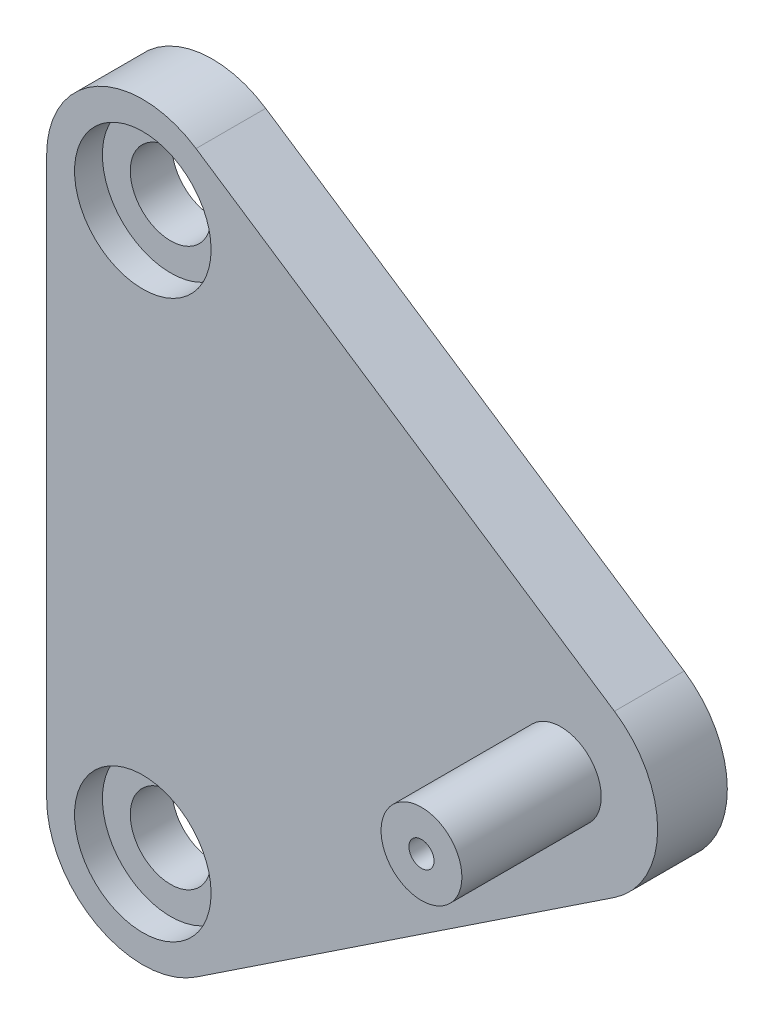
ISO-10303-21;
HEADER;
FILE_DESCRIPTION(('STEP AP214'),'2;1');
FILE_NAME('part.step','',(''),(''),'','','');
FILE_SCHEMA(('AUTOMOTIVE_DESIGN { 1 0 10303 214 1 1 1 1 }'));
ENDSEC;
DATA;
#1=APPLICATION_CONTEXT('core data for automotive mechanical design processes');
#2=APPLICATION_PROTOCOL_DEFINITION('international standard','automotive_design',2000,#1);
#3=PRODUCT_CONTEXT('',#1,'mechanical');
#4=PRODUCT('Part','Part','',(#3));
#5=PRODUCT_RELATED_PRODUCT_CATEGORY('part','',(#4));
#6=PRODUCT_DEFINITION_FORMATION('','',#4);
#7=PRODUCT_DEFINITION_CONTEXT('part definition',#1,'design');
#8=PRODUCT_DEFINITION('design','',#6,#7);
#9=PRODUCT_DEFINITION_SHAPE('','',#8);
#10=(LENGTH_UNIT() NAMED_UNIT(*) SI_UNIT(.MILLI.,.METRE.));
#11=(NAMED_UNIT(*) PLANE_ANGLE_UNIT() SI_UNIT($,.RADIAN.));
#12=(NAMED_UNIT(*) SI_UNIT($,.STERADIAN.) SOLID_ANGLE_UNIT());
#13=UNCERTAINTY_MEASURE_WITH_UNIT(LENGTH_MEASURE(1.E-05),#10,'distance_accuracy_value','');
#14=(GEOMETRIC_REPRESENTATION_CONTEXT(3) GLOBAL_UNCERTAINTY_ASSIGNED_CONTEXT((#13)) GLOBAL_UNIT_ASSIGNED_CONTEXT((#10,
#11,#12)) REPRESENTATION_CONTEXT('',''));
#15=CARTESIAN_POINT('',(0.,0.,0.));
#16=DIRECTION('',(0.,0.,1.));
#17=DIRECTION('',(1.,0.,0.));
#18=AXIS2_PLACEMENT_3D('',#15,#16,#17);
#19=CARTESIAN_POINT('',(0.,10.,2.5));
#20=DIRECTION('',(0.,0.,-1.));
#21=DIRECTION('',(-1.,0.,0.));
#22=AXIS2_PLACEMENT_3D('',#19,#20,#21);
#23=CYLINDRICAL_SURFACE('',#22,1.45);
#24=CARTESIAN_POINT('',(0.,10.,0.));
#25=DIRECTION('',(0.,0.,1.));
#26=DIRECTION('',(1.,0.,0.));
#27=AXIS2_PLACEMENT_3D('',#24,#25,#26);
#28=CIRCLE('',#27,1.45);
#29=CARTESIAN_POINT('',(1.45,10.,0.));
#30=VERTEX_POINT('',#29);
#31=EDGE_CURVE('E131',#30,#30,#28,.T.);
#32=ORIENTED_EDGE('',*,*,#31,.F.);
#33=EDGE_LOOP('',(#32));
#34=FACE_BOUND('',#33,.T.);
#35=CARTESIAN_POINT('',(0.,10.,1.5));
#36=DIRECTION('',(0.,0.,1.));
#37=DIRECTION('',(1.,0.,0.));
#38=AXIS2_PLACEMENT_3D('',#35,#36,#37);
#39=CIRCLE('',#38,1.45);
#40=CARTESIAN_POINT('',(1.45,10.,1.5));
#41=VERTEX_POINT('',#40);
#42=EDGE_CURVE('E44',#41,#41,#39,.T.);
#43=ORIENTED_EDGE('',*,*,#42,.T.);
#44=EDGE_LOOP('',(#43));
#45=FACE_BOUND('',#44,.T.);
#46=ADVANCED_FACE('F40',(#34,#45),#23,.F.);
#47=CARTESIAN_POINT('',(0.,-10.,2.5));
#48=DIRECTION('',(0.,0.,-1.));
#49=DIRECTION('',(-1.,0.,0.));
#50=AXIS2_PLACEMENT_3D('',#47,#48,#49);
#51=CYLINDRICAL_SURFACE('',#50,1.45);
#52=CARTESIAN_POINT('',(0.,-10.,0.));
#53=DIRECTION('',(0.,0.,1.));
#54=DIRECTION('',(-1.,0.,0.));
#55=AXIS2_PLACEMENT_3D('',#52,#53,#54);
#56=CIRCLE('',#55,1.45);
#57=CARTESIAN_POINT('',(-1.45,-10.,0.));
#58=VERTEX_POINT('',#57);
#59=EDGE_CURVE('E149',#58,#58,#56,.T.);
#60=ORIENTED_EDGE('',*,*,#59,.F.);
#61=EDGE_LOOP('',(#60));
#62=FACE_BOUND('',#61,.T.);
#63=CARTESIAN_POINT('',(0.,-10.,1.5));
#64=DIRECTION('',(0.,0.,1.));
#65=DIRECTION('',(1.,0.,0.));
#66=AXIS2_PLACEMENT_3D('',#63,#64,#65);
#67=CIRCLE('',#66,1.45);
#68=CARTESIAN_POINT('',(1.45,-10.,1.5));
#69=VERTEX_POINT('',#68);
#70=EDGE_CURVE('E143',#69,#69,#67,.T.);
#71=ORIENTED_EDGE('',*,*,#70,.T.);
#72=EDGE_LOOP('',(#71));
#73=FACE_BOUND('',#72,.T.);
#74=ADVANCED_FACE('F198',(#62,#73),#51,.F.);
#75=CARTESIAN_POINT('',(0.,10.,2.5));
#76=DIRECTION('',(0.,0.,1.));
#77=DIRECTION('',(1.,0.,0.));
#78=AXIS2_PLACEMENT_3D('',#75,#76,#77);
#79=PLANE('',#78);
#80=CARTESIAN_POINT('',(15.,0.,2.5));
#81=DIRECTION('',(0.,0.,1.));
#82=DIRECTION('',(1.,0.,0.));
#83=AXIS2_PLACEMENT_3D('',#80,#81,#82);
#84=CIRCLE('',#83,1.45);
#85=CARTESIAN_POINT('',(16.45,0.,2.5));
#86=VERTEX_POINT('',#85);
#87=EDGE_CURVE('E159',#86,#86,#84,.T.);
#88=ORIENTED_EDGE('',*,*,#87,.F.);
#89=EDGE_LOOP('',(#88));
#90=FACE_BOUND('',#89,.T.);
#91=CARTESIAN_POINT('',(0.,10.,2.5));
#92=DIRECTION('',(0.,0.,1.));
#93=DIRECTION('',(1.,0.,0.));
#94=AXIS2_PLACEMENT_3D('',#91,#92,#93);
#95=CIRCLE('',#94,2.45);
#96=CARTESIAN_POINT('',(2.45,10.,2.5));
#97=VERTEX_POINT('',#96);
#98=EDGE_CURVE('E151',#97,#97,#95,.T.);
#99=ORIENTED_EDGE('',*,*,#98,.F.);
#100=EDGE_LOOP('',(#99));
#101=FACE_BOUND('',#100,.T.);
#102=CARTESIAN_POINT('',(0.,-10.,2.5));
#103=DIRECTION('',(0.,0.,1.));
#104=DIRECTION('',(1.,0.,0.));
#105=AXIS2_PLACEMENT_3D('',#102,#103,#104);
#106=CIRCLE('',#105,2.45);
#107=CARTESIAN_POINT('',(2.45,-10.,2.5));
#108=VERTEX_POINT('',#107);
#109=EDGE_CURVE('E156',#108,#108,#106,.T.);
#110=ORIENTED_EDGE('',*,*,#109,.F.);
#111=EDGE_LOOP('',(#110));
#112=FACE_BOUND('',#111,.T.);
#113=CARTESIAN_POINT('',(0.,10.,2.5));
#114=DIRECTION('',(0.,0.,1.));
#115=DIRECTION('',(1.,0.,0.));
#116=AXIS2_PLACEMENT_3D('',#113,#114,#115);
#117=CIRCLE('',#116,3.45);
#118=CARTESIAN_POINT('',(1.90973306763416,12.8732246014512,2.5));
#119=VERTEX_POINT('',#118);
#120=CARTESIAN_POINT('',(-3.45,10.,2.5));
#121=VERTEX_POINT('',#120);
#122=EDGE_CURVE('E138',#119,#121,#117,.T.);
#123=ORIENTED_EDGE('',*,*,#122,.T.);
#124=DIRECTION('',(0.,-1.,0.));
#125=VECTOR('',#124,1.);
#126=CARTESIAN_POINT('',(-3.45,10.,2.5));
#127=LINE('',#126,#125);
#128=CARTESIAN_POINT('',(-3.45,-10.,2.5));
#129=VERTEX_POINT('',#128);
#130=EDGE_CURVE('E96',#121,#129,#127,.T.);
#131=ORIENTED_EDGE('',*,*,#130,.T.);
#132=CARTESIAN_POINT('',(0.,-10.,2.5));
#133=DIRECTION('',(0.,0.,1.));
#134=DIRECTION('',(-1.,0.,0.));
#135=AXIS2_PLACEMENT_3D('',#132,#133,#134);
#136=CIRCLE('',#135,3.45);
#137=CARTESIAN_POINT('',(1.90973306763416,-12.8732246014512,2.5));
#138=VERTEX_POINT('',#137);
#139=EDGE_CURVE('E109',#129,#138,#136,.T.);
#140=ORIENTED_EDGE('',*,*,#139,.T.);
#141=DIRECTION('',(0.83281872505833,0.553545816705553,0.));
#142=VECTOR('',#141,1.);
#143=CARTESIAN_POINT('',(1.90973306763416,-12.8732246014512,2.5));
#144=LINE('',#143,#142);
#145=CARTESIAN_POINT('',(16.9235717130518,-2.8940450695777,2.5));
#146=VERTEX_POINT('',#145);
#147=EDGE_CURVE('E103',#138,#146,#144,.T.);
#148=ORIENTED_EDGE('',*,*,#147,.T.);
#149=CARTESIAN_POINT('',(15.,0.,2.5));
#150=DIRECTION('',(0.,0.,1.));
#151=DIRECTION('',(1.,0.,0.));
#152=AXIS2_PLACEMENT_3D('',#149,#150,#151);
#153=CIRCLE('',#152,3.475);
#154=CARTESIAN_POINT('',(16.9235717130518,2.8940450695777,2.5));
#155=VERTEX_POINT('',#154);
#156=EDGE_CURVE('E107',#146,#155,#153,.T.);
#157=ORIENTED_EDGE('',*,*,#156,.T.);
#158=DIRECTION('',(-0.83281872505833,0.553545816705553,0.));
#159=VECTOR('',#158,1.);
#160=CARTESIAN_POINT('',(1.90973306763416,12.8732246014512,2.5));
#161=LINE('',#160,#159);
#162=EDGE_CURVE('E59',#155,#119,#161,.T.);
#163=ORIENTED_EDGE('',*,*,#162,.T.);
#164=EDGE_LOOP('',(#123,#131,#140,#148,#157,#163));
#165=FACE_BOUND('',#164,.T.);
#166=ADVANCED_FACE('F105',(#90,#101,#112,#165),#79,.T.);
#167=CARTESIAN_POINT('',(0.,10.,0.));
#168=DIRECTION('',(0.,0.,1.));
#169=DIRECTION('',(1.,0.,0.));
#170=AXIS2_PLACEMENT_3D('',#167,#168,#169);
#171=PLANE('',#170);
#172=CARTESIAN_POINT('',(15.,0.,0.));
#173=DIRECTION('',(0.,0.,1.));
#174=DIRECTION('',(1.,0.,0.));
#175=AXIS2_PLACEMENT_3D('',#172,#173,#174);
#176=CIRCLE('',#175,0.449999999999998);
#177=CARTESIAN_POINT('',(15.45,0.,0.));
#178=VERTEX_POINT('',#177);
#179=EDGE_CURVE('E221',#178,#178,#176,.T.);
#180=ORIENTED_EDGE('',*,*,#179,.T.);
#181=EDGE_LOOP('',(#180));
#182=FACE_BOUND('',#181,.T.);
#183=CARTESIAN_POINT('',(0.,10.,0.));
#184=DIRECTION('',(0.,0.,1.));
#185=DIRECTION('',(1.,0.,0.));
#186=AXIS2_PLACEMENT_3D('',#183,#184,#185);
#187=CIRCLE('',#186,3.45);
#188=CARTESIAN_POINT('',(1.90973306763416,12.8732246014512,0.));
#189=VERTEX_POINT('',#188);
#190=CARTESIAN_POINT('',(-3.45,10.,0.));
#191=VERTEX_POINT('',#190);
#192=EDGE_CURVE('E127',#189,#191,#187,.T.);
#193=ORIENTED_EDGE('',*,*,#192,.F.);
#194=DIRECTION('',(-0.83281872505833,0.553545816705553,0.));
#195=VECTOR('',#194,1.);
#196=CARTESIAN_POINT('',(1.90973306763416,12.8732246014512,0.));
#197=LINE('',#196,#195);
#198=CARTESIAN_POINT('',(16.9235717130518,2.8940450695777,0.));
#199=VERTEX_POINT('',#198);
#200=EDGE_CURVE('E88',#199,#189,#197,.T.);
#201=ORIENTED_EDGE('',*,*,#200,.F.);
#202=CARTESIAN_POINT('',(15.,0.,0.));
#203=DIRECTION('',(0.,0.,1.));
#204=DIRECTION('',(1.,0.,0.));
#205=AXIS2_PLACEMENT_3D('',#202,#203,#204);
#206=CIRCLE('',#205,3.475);
#207=CARTESIAN_POINT('',(16.9235717130518,-2.8940450695777,0.));
#208=VERTEX_POINT('',#207);
#209=EDGE_CURVE('E82',#208,#199,#206,.T.);
#210=ORIENTED_EDGE('',*,*,#209,.F.);
#211=DIRECTION('',(0.83281872505833,0.553545816705553,0.));
#212=VECTOR('',#211,1.);
#213=CARTESIAN_POINT('',(1.90973306763416,-12.8732246014512,0.));
#214=LINE('',#213,#212);
#215=CARTESIAN_POINT('',(1.90973306763416,-12.8732246014512,0.));
#216=VERTEX_POINT('',#215);
#217=EDGE_CURVE('E117',#216,#208,#214,.T.);
#218=ORIENTED_EDGE('',*,*,#217,.F.);
#219=CARTESIAN_POINT('',(0.,-10.,0.));
#220=DIRECTION('',(0.,0.,1.));
#221=DIRECTION('',(-1.,0.,0.));
#222=AXIS2_PLACEMENT_3D('',#219,#220,#221);
#223=CIRCLE('',#222,3.45);
#224=CARTESIAN_POINT('',(-3.45,-10.,0.));
#225=VERTEX_POINT('',#224);
#226=EDGE_CURVE('E133',#225,#216,#223,.T.);
#227=ORIENTED_EDGE('',*,*,#226,.F.);
#228=DIRECTION('',(0.,-1.,0.));
#229=VECTOR('',#228,1.);
#230=CARTESIAN_POINT('',(-3.45,10.,0.));
#231=LINE('',#230,#229);
#232=EDGE_CURVE('E130',#191,#225,#231,.T.);
#233=ORIENTED_EDGE('',*,*,#232,.F.);
#234=EDGE_LOOP('',(#193,#201,#210,#218,#227,#233));
#235=FACE_BOUND('',#234,.T.);
#236=ORIENTED_EDGE('',*,*,#31,.T.);
#237=EDGE_LOOP('',(#236));
#238=FACE_BOUND('',#237,.T.);
#239=ORIENTED_EDGE('',*,*,#59,.T.);
#240=EDGE_LOOP('',(#239));
#241=FACE_BOUND('',#240,.T.);
#242=ADVANCED_FACE('F181',(#182,#235,#238,#241),#171,.F.);
#243=CARTESIAN_POINT('',(0.,10.,2.5));
#244=DIRECTION('',(0.,0.,-1.));
#245=DIRECTION('',(-1.,0.,0.));
#246=AXIS2_PLACEMENT_3D('',#243,#244,#245);
#247=CYLINDRICAL_SURFACE('',#246,3.45);
#248=ORIENTED_EDGE('',*,*,#192,.T.);
#249=DIRECTION('',(0.,0.,-1.));
#250=VECTOR('',#249,1.);
#251=CARTESIAN_POINT('',(-3.45,10.,2.5));
#252=LINE('',#251,#250);
#253=EDGE_CURVE('E12',#121,#191,#252,.T.);
#254=ORIENTED_EDGE('',*,*,#253,.F.);
#255=ORIENTED_EDGE('',*,*,#122,.F.);
#256=DIRECTION('',(0.,0.,-1.));
#257=VECTOR('',#256,1.);
#258=CARTESIAN_POINT('',(1.90973306763416,12.8732246014512,2.5));
#259=LINE('',#258,#257);
#260=EDGE_CURVE('E123',#119,#189,#259,.T.);
#261=ORIENTED_EDGE('',*,*,#260,.T.);
#262=EDGE_LOOP('',(#248,#254,#255,#261));
#263=FACE_BOUND('',#262,.T.);
#264=ADVANCED_FACE('F42',(#263),#247,.T.);
#265=CARTESIAN_POINT('',(-3.45,10.,2.5));
#266=DIRECTION('',(1.,0.,0.));
#267=DIRECTION('',(0.,1.,0.));
#268=AXIS2_PLACEMENT_3D('',#265,#266,#267);
#269=PLANE('',#268);
#270=ORIENTED_EDGE('',*,*,#232,.T.);
#271=DIRECTION('',(0.,0.,-1.));
#272=VECTOR('',#271,1.);
#273=CARTESIAN_POINT('',(-3.45,-10.,2.5));
#274=LINE('',#273,#272);
#275=EDGE_CURVE('E50',#129,#225,#274,.T.);
#276=ORIENTED_EDGE('',*,*,#275,.F.);
#277=ORIENTED_EDGE('',*,*,#130,.F.);
#278=ORIENTED_EDGE('',*,*,#253,.T.);
#279=EDGE_LOOP('',(#270,#276,#277,#278));
#280=FACE_BOUND('',#279,.T.);
#281=ADVANCED_FACE('F175',(#280),#269,.F.);
#282=CARTESIAN_POINT('',(0.,-10.,2.5));
#283=DIRECTION('',(0.,0.,-1.));
#284=DIRECTION('',(-1.,0.,0.));
#285=AXIS2_PLACEMENT_3D('',#282,#283,#284);
#286=CYLINDRICAL_SURFACE('',#285,3.45);
#287=ORIENTED_EDGE('',*,*,#226,.T.);
#288=DIRECTION('',(0.,0.,-1.));
#289=VECTOR('',#288,1.);
#290=CARTESIAN_POINT('',(1.90973306763416,-12.8732246014512,2.5));
#291=LINE('',#290,#289);
#292=EDGE_CURVE('E118',#138,#216,#291,.T.);
#293=ORIENTED_EDGE('',*,*,#292,.F.);
#294=ORIENTED_EDGE('',*,*,#139,.F.);
#295=ORIENTED_EDGE('',*,*,#275,.T.);
#296=EDGE_LOOP('',(#287,#293,#294,#295));
#297=FACE_BOUND('',#296,.T.);
#298=ADVANCED_FACE('F178',(#297),#286,.T.);
#299=CARTESIAN_POINT('',(1.90973306763416,-12.8732246014512,2.5));
#300=DIRECTION('',(-0.553545816705553,0.83281872505833,0.));
#301=DIRECTION('',(-0.83281872505833,-0.553545816705553,0.));
#302=AXIS2_PLACEMENT_3D('',#299,#300,#301);
#303=PLANE('',#302);
#304=ORIENTED_EDGE('',*,*,#217,.T.);
#305=DIRECTION('',(0.,0.,-1.));
#306=VECTOR('',#305,1.);
#307=CARTESIAN_POINT('',(16.9235717130518,-2.8940450695777,2.5));
#308=LINE('',#307,#306);
#309=EDGE_CURVE('E114',#146,#208,#308,.T.);
#310=ORIENTED_EDGE('',*,*,#309,.F.);
#311=ORIENTED_EDGE('',*,*,#147,.F.);
#312=ORIENTED_EDGE('',*,*,#292,.T.);
#313=EDGE_LOOP('',(#304,#310,#311,#312));
#314=FACE_BOUND('',#313,.T.);
#315=ADVANCED_FACE('F115',(#314),#303,.F.);
#316=CARTESIAN_POINT('',(15.,0.,2.5));
#317=DIRECTION('',(0.,0.,-1.));
#318=DIRECTION('',(-1.,0.,0.));
#319=AXIS2_PLACEMENT_3D('',#316,#317,#318);
#320=CYLINDRICAL_SURFACE('',#319,3.475);
#321=ORIENTED_EDGE('',*,*,#209,.T.);
#322=DIRECTION('',(0.,0.,-1.));
#323=VECTOR('',#322,1.);
#324=CARTESIAN_POINT('',(16.9235717130518,2.8940450695777,2.5));
#325=LINE('',#324,#323);
#326=EDGE_CURVE('E119',#155,#199,#325,.T.);
#327=ORIENTED_EDGE('',*,*,#326,.F.);
#328=ORIENTED_EDGE('',*,*,#156,.F.);
#329=ORIENTED_EDGE('',*,*,#309,.T.);
#330=EDGE_LOOP('',(#321,#327,#328,#329));
#331=FACE_BOUND('',#330,.T.);
#332=ADVANCED_FACE('F121',(#331),#320,.T.);
#333=CARTESIAN_POINT('',(1.90973306763416,12.8732246014512,2.5));
#334=DIRECTION('',(-0.553545816705553,-0.83281872505833,0.));
#335=DIRECTION('',(0.83281872505833,-0.553545816705553,0.));
#336=AXIS2_PLACEMENT_3D('',#333,#334,#335);
#337=PLANE('',#336);
#338=ORIENTED_EDGE('',*,*,#200,.T.);
#339=ORIENTED_EDGE('',*,*,#260,.F.);
#340=ORIENTED_EDGE('',*,*,#162,.F.);
#341=ORIENTED_EDGE('',*,*,#326,.T.);
#342=EDGE_LOOP('',(#338,#339,#340,#341));
#343=FACE_BOUND('',#342,.T.);
#344=ADVANCED_FACE('F184',(#343),#337,.F.);
#345=CARTESIAN_POINT('',(0.,-10.,1.5));
#346=DIRECTION('',(0.,0.,1.));
#347=DIRECTION('',(1.,0.,0.));
#348=AXIS2_PLACEMENT_3D('',#345,#346,#347);
#349=CYLINDRICAL_SURFACE('',#348,2.45);
#350=CARTESIAN_POINT('',(0.,-10.,1.5));
#351=DIRECTION('',(0.,0.,1.));
#352=DIRECTION('',(1.,0.,0.));
#353=AXIS2_PLACEMENT_3D('',#350,#351,#352);
#354=CIRCLE('',#353,2.45);
#355=CARTESIAN_POINT('',(2.45,-10.,1.5));
#356=VERTEX_POINT('',#355);
#357=EDGE_CURVE('E164',#356,#356,#354,.T.);
#358=ORIENTED_EDGE('',*,*,#357,.F.);
#359=EDGE_LOOP('',(#358));
#360=FACE_BOUND('',#359,.T.);
#361=ORIENTED_EDGE('',*,*,#109,.T.);
#362=EDGE_LOOP('',(#361));
#363=FACE_BOUND('',#362,.T.);
#364=ADVANCED_FACE('F186',(#360,#363),#349,.F.);
#365=CARTESIAN_POINT('',(0.,-10.,1.5));
#366=DIRECTION('',(0.,0.,1.));
#367=DIRECTION('',(1.,0.,0.));
#368=AXIS2_PLACEMENT_3D('',#365,#366,#367);
#369=PLANE('',#368);
#370=ORIENTED_EDGE('',*,*,#70,.F.);
#371=EDGE_LOOP('',(#370));
#372=FACE_BOUND('',#371,.T.);
#373=ORIENTED_EDGE('',*,*,#357,.T.);
#374=EDGE_LOOP('',(#373));
#375=FACE_BOUND('',#374,.T.);
#376=ADVANCED_FACE('F193',(#372,#375),#369,.T.);
#377=CARTESIAN_POINT('',(0.,10.,1.5));
#378=DIRECTION('',(0.,0.,1.));
#379=DIRECTION('',(1.,0.,0.));
#380=AXIS2_PLACEMENT_3D('',#377,#378,#379);
#381=CYLINDRICAL_SURFACE('',#380,2.45);
#382=CARTESIAN_POINT('',(0.,10.,1.5));
#383=DIRECTION('',(0.,0.,1.));
#384=DIRECTION('',(1.,0.,0.));
#385=AXIS2_PLACEMENT_3D('',#382,#383,#384);
#386=CIRCLE('',#385,2.45);
#387=CARTESIAN_POINT('',(2.45,10.,1.5));
#388=VERTEX_POINT('',#387);
#389=EDGE_CURVE('E145',#388,#388,#386,.T.);
#390=ORIENTED_EDGE('',*,*,#389,.F.);
#391=EDGE_LOOP('',(#390));
#392=FACE_BOUND('',#391,.T.);
#393=ORIENTED_EDGE('',*,*,#98,.T.);
#394=EDGE_LOOP('',(#393));
#395=FACE_BOUND('',#394,.T.);
#396=ADVANCED_FACE('F240',(#392,#395),#381,.F.);
#397=CARTESIAN_POINT('',(0.,10.,1.5));
#398=DIRECTION('',(0.,0.,1.));
#399=DIRECTION('',(1.,0.,0.));
#400=AXIS2_PLACEMENT_3D('',#397,#398,#399);
#401=PLANE('',#400);
#402=ORIENTED_EDGE('',*,*,#42,.F.);
#403=EDGE_LOOP('',(#402));
#404=FACE_BOUND('',#403,.T.);
#405=ORIENTED_EDGE('',*,*,#389,.T.);
#406=EDGE_LOOP('',(#405));
#407=FACE_BOUND('',#406,.T.);
#408=ADVANCED_FACE('F242',(#404,#407),#401,.T.);
#409=CARTESIAN_POINT('',(15.,0.,7.5));
#410=DIRECTION('',(0.,0.,1.));
#411=DIRECTION('',(1.,0.,0.));
#412=AXIS2_PLACEMENT_3D('',#409,#410,#411);
#413=PLANE('',#412);
#414=CARTESIAN_POINT('',(15.,0.,7.5));
#415=DIRECTION('',(0.,0.,1.));
#416=DIRECTION('',(1.,0.,0.));
#417=AXIS2_PLACEMENT_3D('',#414,#415,#416);
#418=CIRCLE('',#417,1.45);
#419=CARTESIAN_POINT('',(16.45,0.,7.5));
#420=VERTEX_POINT('',#419);
#421=EDGE_CURVE('E167',#420,#420,#418,.T.);
#422=ORIENTED_EDGE('',*,*,#421,.T.);
#423=EDGE_LOOP('',(#422));
#424=FACE_BOUND('',#423,.T.);
#425=CARTESIAN_POINT('',(15.,0.,7.5));
#426=DIRECTION('',(0.,0.,1.));
#427=DIRECTION('',(1.,0.,0.));
#428=AXIS2_PLACEMENT_3D('',#425,#426,#427);
#429=CIRCLE('',#428,0.449999999999999);
#430=CARTESIAN_POINT('',(15.45,0.,7.5));
#431=VERTEX_POINT('',#430);
#432=EDGE_CURVE('E223',#431,#431,#429,.T.);
#433=ORIENTED_EDGE('',*,*,#432,.F.);
#434=EDGE_LOOP('',(#433));
#435=FACE_BOUND('',#434,.T.);
#436=ADVANCED_FACE('F249',(#424,#435),#413,.T.);
#437=CARTESIAN_POINT('',(15.,0.,7.5));
#438=DIRECTION('',(0.,0.,-1.));
#439=DIRECTION('',(-1.,0.,0.));
#440=AXIS2_PLACEMENT_3D('',#437,#438,#439);
#441=CYLINDRICAL_SURFACE('',#440,1.45);
#442=ORIENTED_EDGE('',*,*,#421,.F.);
#443=EDGE_LOOP('',(#442));
#444=FACE_BOUND('',#443,.T.);
#445=ORIENTED_EDGE('',*,*,#87,.T.);
#446=EDGE_LOOP('',(#445));
#447=FACE_BOUND('',#446,.T.);
#448=ADVANCED_FACE('F233',(#444,#447),#441,.T.);
#449=CARTESIAN_POINT('',(15.,0.,7.5));
#450=DIRECTION('',(0.,0.,-1.));
#451=DIRECTION('',(-1.,0.,0.));
#452=AXIS2_PLACEMENT_3D('',#449,#450,#451);
#453=CYLINDRICAL_SURFACE('',#452,0.449999999999999);
#454=ORIENTED_EDGE('',*,*,#432,.T.);
#455=EDGE_LOOP('',(#454));
#456=FACE_BOUND('',#455,.T.);
#457=ORIENTED_EDGE('',*,*,#179,.F.);
#458=EDGE_LOOP('',(#457));
#459=FACE_BOUND('',#458,.T.);
#460=ADVANCED_FACE('F255',(#456,#459),#453,.F.);
#461=CLOSED_SHELL('',(#46,#74,#166,#242,#264,#281,#298,#315,#332,#344,#364,#376,#396,#408,#436,
#448,#460));
#462=MANIFOLD_SOLID_BREP('B2',#461);
#463=ADVANCED_BREP_SHAPE_REPRESENTATION('',(#18,#462),#14);
#464=SHAPE_DEFINITION_REPRESENTATION(#9,#463);
ENDSEC;
END-ISO-10303-21;
